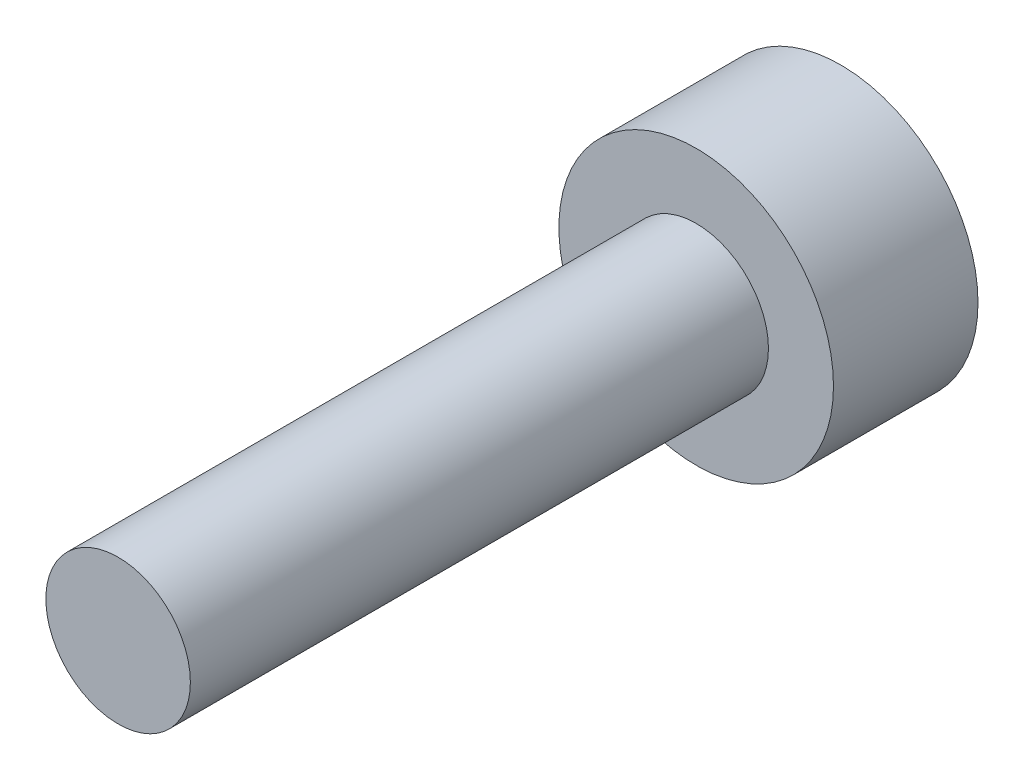
ISO-10303-21;
HEADER;
FILE_DESCRIPTION(('STEP AP214'),'2;1');
FILE_NAME('part.step','',(''),(''),'','','');
FILE_SCHEMA(('AUTOMOTIVE_DESIGN { 1 0 10303 214 1 1 1 1 }'));
ENDSEC;
DATA;
#1=APPLICATION_CONTEXT('core data for automotive mechanical design processes');
#2=APPLICATION_PROTOCOL_DEFINITION('international standard','automotive_design',2000,#1);
#3=PRODUCT_CONTEXT('',#1,'mechanical');
#4=PRODUCT('Part','Part','',(#3));
#5=PRODUCT_RELATED_PRODUCT_CATEGORY('part','',(#4));
#6=PRODUCT_DEFINITION_FORMATION('','',#4);
#7=PRODUCT_DEFINITION_CONTEXT('part definition',#1,'design');
#8=PRODUCT_DEFINITION('design','',#6,#7);
#9=PRODUCT_DEFINITION_SHAPE('','',#8);
#10=(LENGTH_UNIT() NAMED_UNIT(*) SI_UNIT(.MILLI.,.METRE.));
#11=(NAMED_UNIT(*) PLANE_ANGLE_UNIT() SI_UNIT($,.RADIAN.));
#12=(NAMED_UNIT(*) SI_UNIT($,.STERADIAN.) SOLID_ANGLE_UNIT());
#13=UNCERTAINTY_MEASURE_WITH_UNIT(LENGTH_MEASURE(1.E-05),#10,'distance_accuracy_value','');
#14=(GEOMETRIC_REPRESENTATION_CONTEXT(3) GLOBAL_UNCERTAINTY_ASSIGNED_CONTEXT((#13)) GLOBAL_UNIT_ASSIGNED_CONTEXT((#10,
#11,#12)) REPRESENTATION_CONTEXT('',''));
#15=CARTESIAN_POINT('',(0.,0.,0.));
#16=DIRECTION('',(0.,0.,1.));
#17=DIRECTION('',(1.,0.,0.));
#18=AXIS2_PLACEMENT_3D('',#15,#16,#17);
#19=CARTESIAN_POINT('',(0.,0.,0.));
#20=DIRECTION('',(0.,0.,-1.));
#21=DIRECTION('',(-1.,0.,0.));
#22=AXIS2_PLACEMENT_3D('',#19,#20,#21);
#23=CYLINDRICAL_SURFACE('',#22,1.9);
#24=CARTESIAN_POINT('',(0.,0.,0.));
#25=DIRECTION('',(0.,0.,1.));
#26=DIRECTION('',(1.,0.,0.));
#27=AXIS2_PLACEMENT_3D('',#24,#25,#26);
#28=CIRCLE('',#27,1.9);
#29=CARTESIAN_POINT('',(1.9,0.,0.));
#30=VERTEX_POINT('',#29);
#31=EDGE_CURVE('E42',#30,#30,#28,.T.);
#32=ORIENTED_EDGE('',*,*,#31,.F.);
#33=EDGE_LOOP('',(#32));
#34=FACE_BOUND('',#33,.T.);
#35=CARTESIAN_POINT('',(0.,0.,-2.));
#36=DIRECTION('',(0.,0.,1.));
#37=DIRECTION('',(1.,0.,0.));
#38=AXIS2_PLACEMENT_3D('',#35,#36,#37);
#39=CIRCLE('',#38,1.9);
#40=CARTESIAN_POINT('',(1.9,0.,-2.));
#41=VERTEX_POINT('',#40);
#42=EDGE_CURVE('E37',#41,#41,#39,.T.);
#43=ORIENTED_EDGE('',*,*,#42,.T.);
#44=EDGE_LOOP('',(#43));
#45=FACE_BOUND('',#44,.T.);
#46=ADVANCED_FACE('F40',(#34,#45),#23,.T.);
#47=CARTESIAN_POINT('',(0.,0.,0.));
#48=DIRECTION('',(0.,0.,1.));
#49=DIRECTION('',(1.,0.,0.));
#50=AXIS2_PLACEMENT_3D('',#47,#48,#49);
#51=PLANE('',#50);
#52=CARTESIAN_POINT('',(0.,0.,0.));
#53=DIRECTION('',(0.,0.,1.));
#54=DIRECTION('',(1.,0.,0.));
#55=AXIS2_PLACEMENT_3D('',#52,#53,#54);
#56=CIRCLE('',#55,1.);
#57=CARTESIAN_POINT('',(1.,0.,0.));
#58=VERTEX_POINT('',#57);
#59=EDGE_CURVE('E10',#58,#58,#56,.T.);
#60=ORIENTED_EDGE('',*,*,#59,.F.);
#61=EDGE_LOOP('',(#60));
#62=FACE_BOUND('',#61,.T.);
#63=ORIENTED_EDGE('',*,*,#31,.T.);
#64=EDGE_LOOP('',(#63));
#65=FACE_BOUND('',#64,.T.);
#66=ADVANCED_FACE('F62',(#62,#65),#51,.T.);
#67=CARTESIAN_POINT('',(0.,0.,-2.));
#68=DIRECTION('',(0.,0.,1.));
#69=DIRECTION('',(1.,0.,0.));
#70=AXIS2_PLACEMENT_3D('',#67,#68,#69);
#71=PLANE('',#70);
#72=ORIENTED_EDGE('',*,*,#42,.F.);
#73=EDGE_LOOP('',(#72));
#74=FACE_BOUND('',#73,.T.);
#75=ADVANCED_FACE('F59',(#74),#71,.F.);
#76=CARTESIAN_POINT('',(0.,0.,8.));
#77=DIRECTION('',(0.,0.,-1.));
#78=DIRECTION('',(-1.,0.,0.));
#79=AXIS2_PLACEMENT_3D('',#76,#77,#78);
#80=CYLINDRICAL_SURFACE('',#79,1.);
#81=CARTESIAN_POINT('',(0.,0.,8.));
#82=DIRECTION('',(0.,0.,1.));
#83=DIRECTION('',(1.,0.,0.));
#84=AXIS2_PLACEMENT_3D('',#81,#82,#83);
#85=CIRCLE('',#84,1.);
#86=CARTESIAN_POINT('',(1.,0.,8.));
#87=VERTEX_POINT('',#86);
#88=EDGE_CURVE('E49',#87,#87,#85,.T.);
#89=ORIENTED_EDGE('',*,*,#88,.F.);
#90=EDGE_LOOP('',(#89));
#91=FACE_BOUND('',#90,.T.);
#92=ORIENTED_EDGE('',*,*,#59,.T.);
#93=EDGE_LOOP('',(#92));
#94=FACE_BOUND('',#93,.T.);
#95=ADVANCED_FACE('F58',(#91,#94),#80,.T.);
#96=CARTESIAN_POINT('',(0.,0.,8.));
#97=DIRECTION('',(0.,0.,1.));
#98=DIRECTION('',(1.,0.,0.));
#99=AXIS2_PLACEMENT_3D('',#96,#97,#98);
#100=PLANE('',#99);
#101=ORIENTED_EDGE('',*,*,#88,.T.);
#102=EDGE_LOOP('',(#101));
#103=FACE_BOUND('',#102,.T.);
#104=ADVANCED_FACE('F70',(#103),#100,.T.);
#105=CLOSED_SHELL('',(#46,#66,#75,#95,#104));
#106=MANIFOLD_SOLID_BREP('B2',#105);
#107=ADVANCED_BREP_SHAPE_REPRESENTATION('',(#18,#106),#14);
#108=SHAPE_DEFINITION_REPRESENTATION(#9,#107);
ENDSEC;
END-ISO-10303-21;
